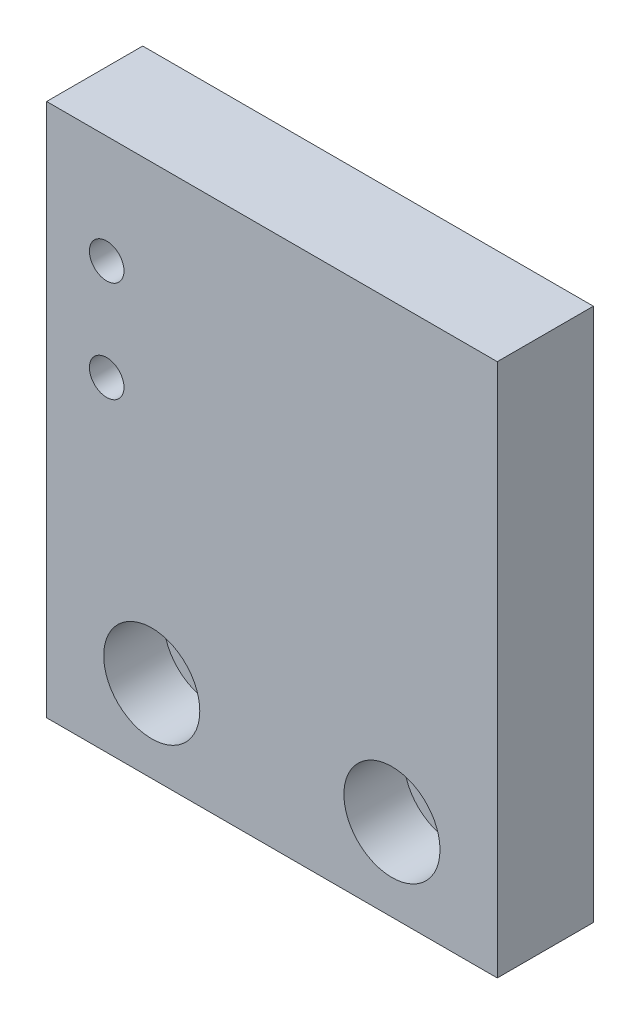
ISO-10303-21;
HEADER;
FILE_DESCRIPTION(('STEP AP214'),'2;1');
FILE_NAME('part.step','',(''),(''),'','','');
FILE_SCHEMA(('AUTOMOTIVE_DESIGN { 1 0 10303 214 1 1 1 1 }'));
ENDSEC;
DATA;
#1=APPLICATION_CONTEXT('core data for automotive mechanical design processes');
#2=APPLICATION_PROTOCOL_DEFINITION('international standard','automotive_design',2000,#1);
#3=PRODUCT_CONTEXT('',#1,'mechanical');
#4=PRODUCT('Part','Part','',(#3));
#5=PRODUCT_RELATED_PRODUCT_CATEGORY('part','',(#4));
#6=PRODUCT_DEFINITION_FORMATION('','',#4);
#7=PRODUCT_DEFINITION_CONTEXT('part definition',#1,'design');
#8=PRODUCT_DEFINITION('design','',#6,#7);
#9=PRODUCT_DEFINITION_SHAPE('','',#8);
#10=(LENGTH_UNIT() NAMED_UNIT(*) SI_UNIT(.MILLI.,.METRE.));
#11=(NAMED_UNIT(*) PLANE_ANGLE_UNIT() SI_UNIT($,.RADIAN.));
#12=(NAMED_UNIT(*) SI_UNIT($,.STERADIAN.) SOLID_ANGLE_UNIT());
#13=UNCERTAINTY_MEASURE_WITH_UNIT(LENGTH_MEASURE(1.E-05),#10,'distance_accuracy_value','');
#14=(GEOMETRIC_REPRESENTATION_CONTEXT(3) GLOBAL_UNCERTAINTY_ASSIGNED_CONTEXT((#13)) GLOBAL_UNIT_ASSIGNED_CONTEXT((#10,
#11,#12)) REPRESENTATION_CONTEXT('',''));
#15=CARTESIAN_POINT('',(0.,0.,0.));
#16=DIRECTION('',(0.,0.,1.));
#17=DIRECTION('',(1.,0.,0.));
#18=AXIS2_PLACEMENT_3D('',#15,#16,#17);
#19=CARTESIAN_POINT('',(0.,0.,10.16));
#20=DIRECTION('',(1.,0.,0.));
#21=DIRECTION('',(0.,0.,-1.));
#22=AXIS2_PLACEMENT_3D('',#19,#20,#21);
#23=PLANE('',#22);
#24=DIRECTION('',(0.,-1.,0.));
#25=VECTOR('',#24,1.);
#26=CARTESIAN_POINT('',(0.,0.,0.));
#27=LINE('',#26,#25);
#28=CARTESIAN_POINT('',(0.,56.4388,0.));
#29=VERTEX_POINT('',#28);
#30=CARTESIAN_POINT('',(0.,0.,0.));
#31=VERTEX_POINT('',#30);
#32=EDGE_CURVE('E98',#29,#31,#27,.T.);
#33=ORIENTED_EDGE('',*,*,#32,.T.);
#34=DIRECTION('',(0.,0.,-1.));
#35=VECTOR('',#34,1.);
#36=CARTESIAN_POINT('',(0.,0.,10.16));
#37=LINE('',#36,#35);
#38=CARTESIAN_POINT('',(0.,0.,10.16));
#39=VERTEX_POINT('',#38);
#40=EDGE_CURVE('E11',#39,#31,#37,.T.);
#41=ORIENTED_EDGE('',*,*,#40,.F.);
#42=DIRECTION('',(0.,-1.,0.));
#43=VECTOR('',#42,1.);
#44=CARTESIAN_POINT('',(0.,0.,10.16));
#45=LINE('',#44,#43);
#46=CARTESIAN_POINT('',(0.,56.4388,10.16));
#47=VERTEX_POINT('',#46);
#48=EDGE_CURVE('E86',#47,#39,#45,.T.);
#49=ORIENTED_EDGE('',*,*,#48,.F.);
#50=DIRECTION('',(0.,0.,-1.));
#51=VECTOR('',#50,1.);
#52=CARTESIAN_POINT('',(0.,56.4388,10.16));
#53=LINE('',#52,#51);
#54=EDGE_CURVE('E94',#47,#29,#53,.T.);
#55=ORIENTED_EDGE('',*,*,#54,.T.);
#56=EDGE_LOOP('',(#33,#41,#49,#55));
#57=FACE_BOUND('',#56,.T.);
#58=ADVANCED_FACE('F35',(#57),#23,.F.);
#59=CARTESIAN_POINT('',(0.,0.,10.16));
#60=DIRECTION('',(0.,1.,0.));
#61=DIRECTION('',(0.,0.,1.));
#62=AXIS2_PLACEMENT_3D('',#59,#60,#61);
#63=PLANE('',#62);
#64=DIRECTION('',(1.,0.,0.));
#65=VECTOR('',#64,1.);
#66=CARTESIAN_POINT('',(0.,0.,0.));
#67=LINE('',#66,#65);
#68=CARTESIAN_POINT('',(47.6504,0.,0.));
#69=VERTEX_POINT('',#68);
#70=EDGE_CURVE('E90',#31,#69,#67,.T.);
#71=ORIENTED_EDGE('',*,*,#70,.T.);
#72=DIRECTION('',(0.,0.,-1.));
#73=VECTOR('',#72,1.);
#74=CARTESIAN_POINT('',(47.6504,0.,10.16));
#75=LINE('',#74,#73);
#76=CARTESIAN_POINT('',(47.6504,0.,10.16));
#77=VERTEX_POINT('',#76);
#78=EDGE_CURVE('E43',#77,#69,#75,.T.);
#79=ORIENTED_EDGE('',*,*,#78,.F.);
#80=DIRECTION('',(1.,0.,0.));
#81=VECTOR('',#80,1.);
#82=CARTESIAN_POINT('',(0.,0.,10.16));
#83=LINE('',#82,#81);
#84=EDGE_CURVE('E81',#39,#77,#83,.T.);
#85=ORIENTED_EDGE('',*,*,#84,.F.);
#86=ORIENTED_EDGE('',*,*,#40,.T.);
#87=EDGE_LOOP('',(#71,#79,#85,#86));
#88=FACE_BOUND('',#87,.T.);
#89=ADVANCED_FACE('F89',(#88),#63,.F.);
#90=CARTESIAN_POINT('',(47.6504,0.,10.16));
#91=DIRECTION('',(-1.,0.,0.));
#92=DIRECTION('',(0.,0.,1.));
#93=AXIS2_PLACEMENT_3D('',#90,#91,#92);
#94=PLANE('',#93);
#95=DIRECTION('',(0.,1.,0.));
#96=VECTOR('',#95,1.);
#97=CARTESIAN_POINT('',(47.6504,0.,0.));
#98=LINE('',#97,#96);
#99=CARTESIAN_POINT('',(47.6504,56.4388,0.));
#100=VERTEX_POINT('',#99);
#101=EDGE_CURVE('E68',#69,#100,#98,.T.);
#102=ORIENTED_EDGE('',*,*,#101,.T.);
#103=DIRECTION('',(0.,0.,-1.));
#104=VECTOR('',#103,1.);
#105=CARTESIAN_POINT('',(47.6504,56.4388,10.16));
#106=LINE('',#105,#104);
#107=CARTESIAN_POINT('',(47.6504,56.4388,10.16));
#108=VERTEX_POINT('',#107);
#109=EDGE_CURVE('E91',#108,#100,#106,.T.);
#110=ORIENTED_EDGE('',*,*,#109,.F.);
#111=DIRECTION('',(0.,1.,0.));
#112=VECTOR('',#111,1.);
#113=CARTESIAN_POINT('',(47.6504,0.,10.16));
#114=LINE('',#113,#112);
#115=EDGE_CURVE('E84',#77,#108,#114,.T.);
#116=ORIENTED_EDGE('',*,*,#115,.F.);
#117=ORIENTED_EDGE('',*,*,#78,.T.);
#118=EDGE_LOOP('',(#102,#110,#116,#117));
#119=FACE_BOUND('',#118,.T.);
#120=ADVANCED_FACE('F92',(#119),#94,.F.);
#121=CARTESIAN_POINT('',(0.,56.4388,10.16));
#122=DIRECTION('',(0.,-1.,0.));
#123=DIRECTION('',(0.,0.,-1.));
#124=AXIS2_PLACEMENT_3D('',#121,#122,#123);
#125=PLANE('',#124);
#126=DIRECTION('',(-1.,0.,0.));
#127=VECTOR('',#126,1.);
#128=CARTESIAN_POINT('',(0.,56.4388,0.));
#129=LINE('',#128,#127);
#130=EDGE_CURVE('E74',#100,#29,#129,.T.);
#131=ORIENTED_EDGE('',*,*,#130,.T.);
#132=ORIENTED_EDGE('',*,*,#54,.F.);
#133=DIRECTION('',(-1.,0.,0.));
#134=VECTOR('',#133,1.);
#135=CARTESIAN_POINT('',(0.,56.4388,10.16));
#136=LINE('',#135,#134);
#137=EDGE_CURVE('E51',#108,#47,#136,.T.);
#138=ORIENTED_EDGE('',*,*,#137,.F.);
#139=ORIENTED_EDGE('',*,*,#109,.T.);
#140=EDGE_LOOP('',(#131,#132,#138,#139));
#141=FACE_BOUND('',#140,.T.);
#142=ADVANCED_FACE('F106',(#141),#125,.F.);
#143=CARTESIAN_POINT('',(0.,0.,10.16));
#144=DIRECTION('',(0.,0.,-1.));
#145=DIRECTION('',(-1.,0.,0.));
#146=AXIS2_PLACEMENT_3D('',#143,#144,#145);
#147=PLANE('',#146);
#148=CARTESIAN_POINT('',(6.35,45.0088,10.16));
#149=DIRECTION('',(0.,0.,-1.));
#150=DIRECTION('',(-1.,0.,0.));
#151=AXIS2_PLACEMENT_3D('',#148,#149,#150);
#152=CIRCLE('',#151,1.8288);
#153=CARTESIAN_POINT('',(4.5212,45.0088,10.16));
#154=VERTEX_POINT('',#153);
#155=EDGE_CURVE('E147',#154,#154,#152,.T.);
#156=ORIENTED_EDGE('',*,*,#155,.T.);
#157=EDGE_LOOP('',(#156));
#158=FACE_BOUND('',#157,.T.);
#159=CARTESIAN_POINT('',(6.35,34.3408,10.16));
#160=DIRECTION('',(0.,0.,-1.));
#161=DIRECTION('',(-1.,0.,0.));
#162=AXIS2_PLACEMENT_3D('',#159,#160,#161);
#163=CIRCLE('',#162,1.8288);
#164=CARTESIAN_POINT('',(4.5212,34.3408,10.16));
#165=VERTEX_POINT('',#164);
#166=EDGE_CURVE('E135',#165,#165,#163,.T.);
#167=ORIENTED_EDGE('',*,*,#166,.T.);
#168=EDGE_LOOP('',(#167));
#169=FACE_BOUND('',#168,.T.);
#170=CARTESIAN_POINT('',(11.1125,8.7122,10.16));
#171=DIRECTION('',(0.,0.,1.));
#172=DIRECTION('',(1.,0.,0.));
#173=AXIS2_PLACEMENT_3D('',#170,#171,#172);
#174=CIRCLE('',#173,5.08);
#175=CARTESIAN_POINT('',(16.1925,8.7122,10.16));
#176=VERTEX_POINT('',#175);
#177=EDGE_CURVE('E132',#176,#176,#174,.T.);
#178=ORIENTED_EDGE('',*,*,#177,.F.);
#179=EDGE_LOOP('',(#178));
#180=FACE_BOUND('',#179,.T.);
#181=CARTESIAN_POINT('',(36.5125,8.7122,10.16));
#182=DIRECTION('',(0.,0.,1.));
#183=DIRECTION('',(1.,0.,0.));
#184=AXIS2_PLACEMENT_3D('',#181,#182,#183);
#185=CIRCLE('',#184,5.08);
#186=CARTESIAN_POINT('',(41.5925,8.7122,10.16));
#187=VERTEX_POINT('',#186);
#188=EDGE_CURVE('E120',#187,#187,#185,.T.);
#189=ORIENTED_EDGE('',*,*,#188,.F.);
#190=EDGE_LOOP('',(#189));
#191=FACE_BOUND('',#190,.T.);
#192=ORIENTED_EDGE('',*,*,#48,.T.);
#193=ORIENTED_EDGE('',*,*,#84,.T.);
#194=ORIENTED_EDGE('',*,*,#115,.T.);
#195=ORIENTED_EDGE('',*,*,#137,.T.);
#196=EDGE_LOOP('',(#192,#193,#194,#195));
#197=FACE_BOUND('',#196,.T.);
#198=ADVANCED_FACE('F82',(#158,#169,#180,#191,#197),#147,.F.);
#199=CARTESIAN_POINT('',(0.,0.,0.));
#200=DIRECTION('',(0.,0.,-1.));
#201=DIRECTION('',(-1.,0.,0.));
#202=AXIS2_PLACEMENT_3D('',#199,#200,#201);
#203=PLANE('',#202);
#204=CARTESIAN_POINT('',(6.35,45.0088,0.));
#205=DIRECTION('',(0.,0.,-1.));
#206=DIRECTION('',(-1.,0.,0.));
#207=AXIS2_PLACEMENT_3D('',#204,#205,#206);
#208=CIRCLE('',#207,3.57251);
#209=CARTESIAN_POINT('',(2.77749,45.0088,0.));
#210=VERTEX_POINT('',#209);
#211=EDGE_CURVE('E156',#210,#210,#208,.T.);
#212=ORIENTED_EDGE('',*,*,#211,.F.);
#213=EDGE_LOOP('',(#212));
#214=FACE_BOUND('',#213,.T.);
#215=CARTESIAN_POINT('',(6.35,34.3408,0.));
#216=DIRECTION('',(0.,0.,-1.));
#217=DIRECTION('',(-1.,0.,0.));
#218=AXIS2_PLACEMENT_3D('',#215,#216,#217);
#219=CIRCLE('',#218,3.57251);
#220=CARTESIAN_POINT('',(2.77749,34.3408,0.));
#221=VERTEX_POINT('',#220);
#222=EDGE_CURVE('E144',#221,#221,#219,.T.);
#223=ORIENTED_EDGE('',*,*,#222,.F.);
#224=EDGE_LOOP('',(#223));
#225=FACE_BOUND('',#224,.T.);
#226=CARTESIAN_POINT('',(11.1125,8.7122,0.));
#227=DIRECTION('',(0.,0.,1.));
#228=DIRECTION('',(1.,0.,0.));
#229=AXIS2_PLACEMENT_3D('',#226,#227,#228);
#230=CIRCLE('',#229,3.2639);
#231=CARTESIAN_POINT('',(14.3764,8.7122,0.));
#232=VERTEX_POINT('',#231);
#233=EDGE_CURVE('E123',#232,#232,#230,.T.);
#234=ORIENTED_EDGE('',*,*,#233,.T.);
#235=EDGE_LOOP('',(#234));
#236=FACE_BOUND('',#235,.T.);
#237=CARTESIAN_POINT('',(36.5125,8.7122,0.));
#238=DIRECTION('',(0.,0.,1.));
#239=DIRECTION('',(1.,0.,0.));
#240=AXIS2_PLACEMENT_3D('',#237,#238,#239);
#241=CIRCLE('',#240,3.2639);
#242=CARTESIAN_POINT('',(39.7764,8.7122,0.));
#243=VERTEX_POINT('',#242);
#244=EDGE_CURVE('E101',#243,#243,#241,.T.);
#245=ORIENTED_EDGE('',*,*,#244,.T.);
#246=EDGE_LOOP('',(#245));
#247=FACE_BOUND('',#246,.T.);
#248=ORIENTED_EDGE('',*,*,#32,.F.);
#249=ORIENTED_EDGE('',*,*,#130,.F.);
#250=ORIENTED_EDGE('',*,*,#101,.F.);
#251=ORIENTED_EDGE('',*,*,#70,.F.);
#252=EDGE_LOOP('',(#248,#249,#250,#251));
#253=FACE_BOUND('',#252,.T.);
#254=ADVANCED_FACE('F109',(#214,#225,#236,#247,#253),#203,.T.);
#255=CARTESIAN_POINT('',(36.5125,8.7122,10.16));
#256=DIRECTION('',(0.,0.,1.));
#257=DIRECTION('',(1.,0.,0.));
#258=AXIS2_PLACEMENT_3D('',#255,#256,#257);
#259=CYLINDRICAL_SURFACE('',#258,3.2639);
#260=ORIENTED_EDGE('',*,*,#244,.F.);
#261=EDGE_LOOP('',(#260));
#262=FACE_BOUND('',#261,.T.);
#263=CARTESIAN_POINT('',(36.5125,8.7122,3.81));
#264=DIRECTION('',(0.,0.,1.));
#265=DIRECTION('',(1.,0.,0.));
#266=AXIS2_PLACEMENT_3D('',#263,#264,#265);
#267=CIRCLE('',#266,3.2639);
#268=CARTESIAN_POINT('',(39.7764,8.7122,3.81));
#269=VERTEX_POINT('',#268);
#270=EDGE_CURVE('E114',#269,#269,#267,.T.);
#271=ORIENTED_EDGE('',*,*,#270,.T.);
#272=EDGE_LOOP('',(#271));
#273=FACE_BOUND('',#272,.T.);
#274=ADVANCED_FACE('F164',(#262,#273),#259,.F.);
#275=CARTESIAN_POINT('',(39.7764,8.7122,3.81));
#276=DIRECTION('',(0.,0.,-1.));
#277=DIRECTION('',(-1.,0.,0.));
#278=AXIS2_PLACEMENT_3D('',#275,#276,#277);
#279=PLANE('',#278);
#280=ORIENTED_EDGE('',*,*,#270,.F.);
#281=EDGE_LOOP('',(#280));
#282=FACE_BOUND('',#281,.T.);
#283=CARTESIAN_POINT('',(36.5125,8.7122,3.81));
#284=DIRECTION('',(0.,0.,1.));
#285=DIRECTION('',(1.,0.,0.));
#286=AXIS2_PLACEMENT_3D('',#283,#284,#285);
#287=CIRCLE('',#286,5.08);
#288=CARTESIAN_POINT('',(41.5925,8.7122,3.81));
#289=VERTEX_POINT('',#288);
#290=EDGE_CURVE('E117',#289,#289,#287,.T.);
#291=ORIENTED_EDGE('',*,*,#290,.T.);
#292=EDGE_LOOP('',(#291));
#293=FACE_BOUND('',#292,.T.);
#294=ADVANCED_FACE('F174',(#282,#293),#279,.F.);
#295=CARTESIAN_POINT('',(36.5125,8.7122,10.16));
#296=DIRECTION('',(0.,0.,1.));
#297=DIRECTION('',(1.,0.,0.));
#298=AXIS2_PLACEMENT_3D('',#295,#296,#297);
#299=CYLINDRICAL_SURFACE('',#298,5.08);
#300=ORIENTED_EDGE('',*,*,#290,.F.);
#301=EDGE_LOOP('',(#300));
#302=FACE_BOUND('',#301,.T.);
#303=ORIENTED_EDGE('',*,*,#188,.T.);
#304=EDGE_LOOP('',(#303));
#305=FACE_BOUND('',#304,.T.);
#306=ADVANCED_FACE('F180',(#302,#305),#299,.F.);
#307=CARTESIAN_POINT('',(11.1125,8.7122,10.16));
#308=DIRECTION('',(0.,0.,1.));
#309=DIRECTION('',(1.,0.,0.));
#310=AXIS2_PLACEMENT_3D('',#307,#308,#309);
#311=CYLINDRICAL_SURFACE('',#310,3.2639);
#312=ORIENTED_EDGE('',*,*,#233,.F.);
#313=EDGE_LOOP('',(#312));
#314=FACE_BOUND('',#313,.T.);
#315=CARTESIAN_POINT('',(11.1125,8.7122,3.81));
#316=DIRECTION('',(0.,0.,1.));
#317=DIRECTION('',(1.,0.,0.));
#318=AXIS2_PLACEMENT_3D('',#315,#316,#317);
#319=CIRCLE('',#318,3.2639);
#320=CARTESIAN_POINT('',(14.3764,8.7122,3.81));
#321=VERTEX_POINT('',#320);
#322=EDGE_CURVE('E126',#321,#321,#319,.T.);
#323=ORIENTED_EDGE('',*,*,#322,.T.);
#324=EDGE_LOOP('',(#323));
#325=FACE_BOUND('',#324,.T.);
#326=ADVANCED_FACE('F186',(#314,#325),#311,.F.);
#327=CARTESIAN_POINT('',(14.3764,8.7122,3.81));
#328=DIRECTION('',(0.,0.,-1.));
#329=DIRECTION('',(-1.,0.,0.));
#330=AXIS2_PLACEMENT_3D('',#327,#328,#329);
#331=PLANE('',#330);
#332=ORIENTED_EDGE('',*,*,#322,.F.);
#333=EDGE_LOOP('',(#332));
#334=FACE_BOUND('',#333,.T.);
#335=CARTESIAN_POINT('',(11.1125,8.7122,3.81));
#336=DIRECTION('',(0.,0.,1.));
#337=DIRECTION('',(1.,0.,0.));
#338=AXIS2_PLACEMENT_3D('',#335,#336,#337);
#339=CIRCLE('',#338,5.08);
#340=CARTESIAN_POINT('',(16.1925,8.7122,3.81));
#341=VERTEX_POINT('',#340);
#342=EDGE_CURVE('E129',#341,#341,#339,.T.);
#343=ORIENTED_EDGE('',*,*,#342,.T.);
#344=EDGE_LOOP('',(#343));
#345=FACE_BOUND('',#344,.T.);
#346=ADVANCED_FACE('F239',(#334,#345),#331,.F.);
#347=CARTESIAN_POINT('',(11.1125,8.7122,10.16));
#348=DIRECTION('',(0.,0.,1.));
#349=DIRECTION('',(1.,0.,0.));
#350=AXIS2_PLACEMENT_3D('',#347,#348,#349);
#351=CYLINDRICAL_SURFACE('',#350,5.08);
#352=ORIENTED_EDGE('',*,*,#342,.F.);
#353=EDGE_LOOP('',(#352));
#354=FACE_BOUND('',#353,.T.);
#355=ORIENTED_EDGE('',*,*,#177,.T.);
#356=EDGE_LOOP('',(#355));
#357=FACE_BOUND('',#356,.T.);
#358=ADVANCED_FACE('F249',(#354,#357),#351,.F.);
#359=CARTESIAN_POINT('',(6.35,34.3408,0.));
#360=DIRECTION('',(0.,0.,-1.));
#361=DIRECTION('',(-1.,0.,0.));
#362=AXIS2_PLACEMENT_3D('',#359,#360,#361);
#363=CYLINDRICAL_SURFACE('',#362,1.8288);
#364=ORIENTED_EDGE('',*,*,#166,.F.);
#365=EDGE_LOOP('',(#364));
#366=FACE_BOUND('',#365,.T.);
#367=CARTESIAN_POINT('',(6.35,34.3408,3.5052));
#368=DIRECTION('',(0.,0.,-1.));
#369=DIRECTION('',(-1.,0.,0.));
#370=AXIS2_PLACEMENT_3D('',#367,#368,#369);
#371=CIRCLE('',#370,1.8288);
#372=CARTESIAN_POINT('',(4.5212,34.3408,3.5052));
#373=VERTEX_POINT('',#372);
#374=EDGE_CURVE('E138',#373,#373,#371,.T.);
#375=ORIENTED_EDGE('',*,*,#374,.T.);
#376=EDGE_LOOP('',(#375));
#377=FACE_BOUND('',#376,.T.);
#378=ADVANCED_FACE('F259',(#366,#377),#363,.F.);
#379=CARTESIAN_POINT('',(8.1788,34.3408,3.5052));
#380=DIRECTION('',(0.,0.,1.));
#381=DIRECTION('',(1.,0.,0.));
#382=AXIS2_PLACEMENT_3D('',#379,#380,#381);
#383=PLANE('',#382);
#384=ORIENTED_EDGE('',*,*,#374,.F.);
#385=EDGE_LOOP('',(#384));
#386=FACE_BOUND('',#385,.T.);
#387=CARTESIAN_POINT('',(6.35,34.3408,3.5052));
#388=DIRECTION('',(0.,0.,-1.));
#389=DIRECTION('',(-1.,0.,0.));
#390=AXIS2_PLACEMENT_3D('',#387,#388,#389);
#391=CIRCLE('',#390,3.57251);
#392=CARTESIAN_POINT('',(2.77749,34.3408,3.5052));
#393=VERTEX_POINT('',#392);
#394=EDGE_CURVE('E141',#393,#393,#391,.T.);
#395=ORIENTED_EDGE('',*,*,#394,.T.);
#396=EDGE_LOOP('',(#395));
#397=FACE_BOUND('',#396,.T.);
#398=ADVANCED_FACE('F270',(#386,#397),#383,.F.);
#399=CARTESIAN_POINT('',(6.35,34.3408,0.));
#400=DIRECTION('',(0.,0.,-1.));
#401=DIRECTION('',(-1.,0.,0.));
#402=AXIS2_PLACEMENT_3D('',#399,#400,#401);
#403=CYLINDRICAL_SURFACE('',#402,3.57251);
#404=ORIENTED_EDGE('',*,*,#394,.F.);
#405=EDGE_LOOP('',(#404));
#406=FACE_BOUND('',#405,.T.);
#407=ORIENTED_EDGE('',*,*,#222,.T.);
#408=EDGE_LOOP('',(#407));
#409=FACE_BOUND('',#408,.T.);
#410=ADVANCED_FACE('F281',(#406,#409),#403,.F.);
#411=CARTESIAN_POINT('',(6.35,45.0088,0.));
#412=DIRECTION('',(0.,0.,-1.));
#413=DIRECTION('',(-1.,0.,0.));
#414=AXIS2_PLACEMENT_3D('',#411,#412,#413);
#415=CYLINDRICAL_SURFACE('',#414,1.8288);
#416=ORIENTED_EDGE('',*,*,#155,.F.);
#417=EDGE_LOOP('',(#416));
#418=FACE_BOUND('',#417,.T.);
#419=CARTESIAN_POINT('',(6.35,45.0088,3.5052));
#420=DIRECTION('',(0.,0.,-1.));
#421=DIRECTION('',(-1.,0.,0.));
#422=AXIS2_PLACEMENT_3D('',#419,#420,#421);
#423=CIRCLE('',#422,1.8288);
#424=CARTESIAN_POINT('',(4.5212,45.0088,3.5052));
#425=VERTEX_POINT('',#424);
#426=EDGE_CURVE('E150',#425,#425,#423,.T.);
#427=ORIENTED_EDGE('',*,*,#426,.T.);
#428=EDGE_LOOP('',(#427));
#429=FACE_BOUND('',#428,.T.);
#430=ADVANCED_FACE('F291',(#418,#429),#415,.F.);
#431=CARTESIAN_POINT('',(8.1788,45.0088,3.5052));
#432=DIRECTION('',(0.,0.,1.));
#433=DIRECTION('',(1.,0.,0.));
#434=AXIS2_PLACEMENT_3D('',#431,#432,#433);
#435=PLANE('',#434);
#436=ORIENTED_EDGE('',*,*,#426,.F.);
#437=EDGE_LOOP('',(#436));
#438=FACE_BOUND('',#437,.T.);
#439=CARTESIAN_POINT('',(6.35,45.0088,3.5052));
#440=DIRECTION('',(0.,0.,-1.));
#441=DIRECTION('',(-1.,0.,0.));
#442=AXIS2_PLACEMENT_3D('',#439,#440,#441);
#443=CIRCLE('',#442,3.57251);
#444=CARTESIAN_POINT('',(2.77749,45.0088,3.5052));
#445=VERTEX_POINT('',#444);
#446=EDGE_CURVE('E153',#445,#445,#443,.T.);
#447=ORIENTED_EDGE('',*,*,#446,.T.);
#448=EDGE_LOOP('',(#447));
#449=FACE_BOUND('',#448,.T.);
#450=ADVANCED_FACE('F301',(#438,#449),#435,.F.);
#451=CARTESIAN_POINT('',(6.35,45.0088,0.));
#452=DIRECTION('',(0.,0.,-1.));
#453=DIRECTION('',(-1.,0.,0.));
#454=AXIS2_PLACEMENT_3D('',#451,#452,#453);
#455=CYLINDRICAL_SURFACE('',#454,3.57251);
#456=ORIENTED_EDGE('',*,*,#446,.F.);
#457=EDGE_LOOP('',(#456));
#458=FACE_BOUND('',#457,.T.);
#459=ORIENTED_EDGE('',*,*,#211,.T.);
#460=EDGE_LOOP('',(#459));
#461=FACE_BOUND('',#460,.T.);
#462=ADVANCED_FACE('F160',(#458,#461),#455,.F.);
#463=CLOSED_SHELL('',(#58,#89,#120,#142,#198,#254,#274,#294,#306,#326,#346,#358,#378,#398,#410,
#430,#450,#462));
#464=MANIFOLD_SOLID_BREP('B2',#463);
#465=ADVANCED_BREP_SHAPE_REPRESENTATION('',(#18,#464),#14);
#466=SHAPE_DEFINITION_REPRESENTATION(#9,#465);
ENDSEC;
END-ISO-10303-21;
